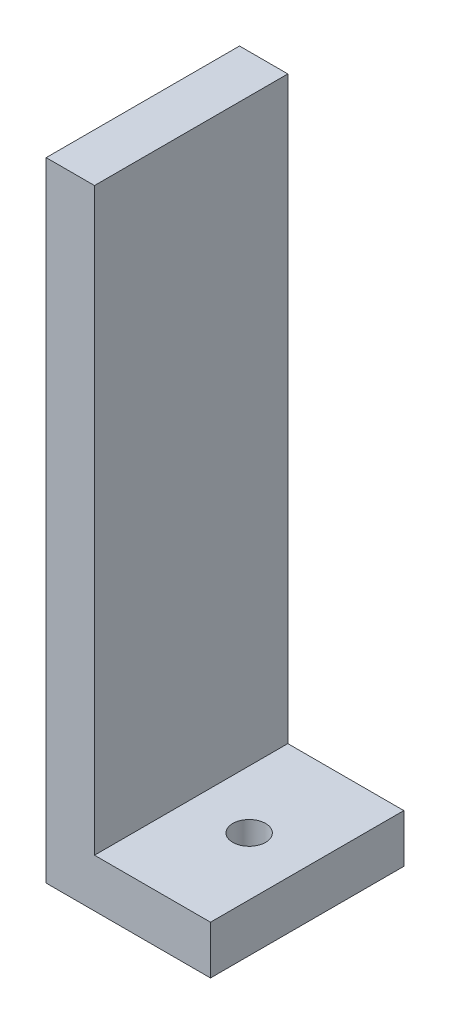
ISO-10303-21;
HEADER;
FILE_DESCRIPTION(('STEP AP214'),'2;1');
FILE_NAME('part.step','',(''),(''),'','','');
FILE_SCHEMA(('AUTOMOTIVE_DESIGN { 1 0 10303 214 1 1 1 1 }'));
ENDSEC;
DATA;
#1=APPLICATION_CONTEXT('core data for automotive mechanical design processes');
#2=APPLICATION_PROTOCOL_DEFINITION('international standard','automotive_design',2000,#1);
#3=PRODUCT_CONTEXT('',#1,'mechanical');
#4=PRODUCT('Part','Part','',(#3));
#5=PRODUCT_RELATED_PRODUCT_CATEGORY('part','',(#4));
#6=PRODUCT_DEFINITION_FORMATION('','',#4);
#7=PRODUCT_DEFINITION_CONTEXT('part definition',#1,'design');
#8=PRODUCT_DEFINITION('design','',#6,#7);
#9=PRODUCT_DEFINITION_SHAPE('','',#8);
#10=(LENGTH_UNIT() NAMED_UNIT(*) SI_UNIT(.MILLI.,.METRE.));
#11=(NAMED_UNIT(*) PLANE_ANGLE_UNIT() SI_UNIT($,.RADIAN.));
#12=(NAMED_UNIT(*) SI_UNIT($,.STERADIAN.) SOLID_ANGLE_UNIT());
#13=UNCERTAINTY_MEASURE_WITH_UNIT(LENGTH_MEASURE(1.E-05),#10,'distance_accuracy_value','');
#14=(GEOMETRIC_REPRESENTATION_CONTEXT(3) GLOBAL_UNCERTAINTY_ASSIGNED_CONTEXT((#13)) GLOBAL_UNIT_ASSIGNED_CONTEXT((#10,
#11,#12)) REPRESENTATION_CONTEXT('',''));
#15=CARTESIAN_POINT('',(0.,0.,0.));
#16=DIRECTION('',(0.,0.,1.));
#17=DIRECTION('',(1.,0.,0.));
#18=AXIS2_PLACEMENT_3D('',#15,#16,#17);
#19=CARTESIAN_POINT('',(0.,0.,20.));
#20=DIRECTION('',(-1.,0.,0.));
#21=DIRECTION('',(0.,0.,1.));
#22=AXIS2_PLACEMENT_3D('',#19,#20,#21);
#23=PLANE('',#22);
#24=DIRECTION('',(0.,1.,0.));
#25=VECTOR('',#24,1.);
#26=CARTESIAN_POINT('',(0.,0.,0.));
#27=LINE('',#26,#25);
#28=CARTESIAN_POINT('',(0.,0.,0.));
#29=VERTEX_POINT('',#28);
#30=CARTESIAN_POINT('',(0.,60.,0.));
#31=VERTEX_POINT('',#30);
#32=EDGE_CURVE('E117',#29,#31,#27,.T.);
#33=ORIENTED_EDGE('',*,*,#32,.T.);
#34=DIRECTION('',(0.,0.,-1.));
#35=VECTOR('',#34,1.);
#36=CARTESIAN_POINT('',(0.,60.,20.));
#37=LINE('',#36,#35);
#38=CARTESIAN_POINT('',(0.,60.,20.));
#39=VERTEX_POINT('',#38);
#40=EDGE_CURVE('E11',#39,#31,#37,.T.);
#41=ORIENTED_EDGE('',*,*,#40,.F.);
#42=DIRECTION('',(0.,1.,0.));
#43=VECTOR('',#42,1.);
#44=CARTESIAN_POINT('',(0.,0.,20.));
#45=LINE('',#44,#43);
#46=CARTESIAN_POINT('',(0.,0.,20.));
#47=VERTEX_POINT('',#46);
#48=EDGE_CURVE('E128',#47,#39,#45,.T.);
#49=ORIENTED_EDGE('',*,*,#48,.F.);
#50=DIRECTION('',(0.,0.,-1.));
#51=VECTOR('',#50,1.);
#52=CARTESIAN_POINT('',(0.,0.,20.));
#53=LINE('',#52,#51);
#54=EDGE_CURVE('E113',#47,#29,#53,.T.);
#55=ORIENTED_EDGE('',*,*,#54,.T.);
#56=EDGE_LOOP('',(#33,#41,#49,#55));
#57=FACE_BOUND('',#56,.T.);
#58=ADVANCED_FACE('F33',(#57),#23,.F.);
#59=CARTESIAN_POINT('',(0.,60.,20.));
#60=DIRECTION('',(0.,-1.,0.));
#61=DIRECTION('',(0.,0.,-1.));
#62=AXIS2_PLACEMENT_3D('',#59,#60,#61);
#63=PLANE('',#62);
#64=DIRECTION('',(-1.,0.,0.));
#65=VECTOR('',#64,1.);
#66=CARTESIAN_POINT('',(0.,60.,0.));
#67=LINE('',#66,#65);
#68=CARTESIAN_POINT('',(-5.,60.,0.));
#69=VERTEX_POINT('',#68);
#70=EDGE_CURVE('E120',#31,#69,#67,.T.);
#71=ORIENTED_EDGE('',*,*,#70,.T.);
#72=DIRECTION('',(0.,0.,-1.));
#73=VECTOR('',#72,1.);
#74=CARTESIAN_POINT('',(-5.,60.,20.));
#75=LINE('',#74,#73);
#76=CARTESIAN_POINT('',(-5.,60.,20.));
#77=VERTEX_POINT('',#76);
#78=EDGE_CURVE('E41',#77,#69,#75,.T.);
#79=ORIENTED_EDGE('',*,*,#78,.F.);
#80=DIRECTION('',(-1.,0.,0.));
#81=VECTOR('',#80,1.);
#82=CARTESIAN_POINT('',(0.,60.,20.));
#83=LINE('',#82,#81);
#84=EDGE_CURVE('E86',#39,#77,#83,.T.);
#85=ORIENTED_EDGE('',*,*,#84,.F.);
#86=ORIENTED_EDGE('',*,*,#40,.T.);
#87=EDGE_LOOP('',(#71,#79,#85,#86));
#88=FACE_BOUND('',#87,.T.);
#89=ADVANCED_FACE('F154',(#88),#63,.F.);
#90=CARTESIAN_POINT('',(-5.,60.,20.));
#91=DIRECTION('',(1.,0.,0.));
#92=DIRECTION('',(0.,1.,0.));
#93=AXIS2_PLACEMENT_3D('',#90,#91,#92);
#94=PLANE('',#93);
#95=DIRECTION('',(0.,-1.,0.));
#96=VECTOR('',#95,1.);
#97=CARTESIAN_POINT('',(-5.,60.,0.));
#98=LINE('',#97,#96);
#99=CARTESIAN_POINT('',(-5.,-5.,0.));
#100=VERTEX_POINT('',#99);
#101=EDGE_CURVE('E123',#69,#100,#98,.T.);
#102=ORIENTED_EDGE('',*,*,#101,.T.);
#103=DIRECTION('',(0.,0.,-1.));
#104=VECTOR('',#103,1.);
#105=CARTESIAN_POINT('',(-5.,-5.,20.));
#106=LINE('',#105,#104);
#107=CARTESIAN_POINT('',(-5.,-5.,20.));
#108=VERTEX_POINT('',#107);
#109=EDGE_CURVE('E108',#108,#100,#106,.T.);
#110=ORIENTED_EDGE('',*,*,#109,.F.);
#111=DIRECTION('',(0.,-1.,0.));
#112=VECTOR('',#111,1.);
#113=CARTESIAN_POINT('',(-5.,60.,20.));
#114=LINE('',#113,#112);
#115=EDGE_CURVE('E99',#77,#108,#114,.T.);
#116=ORIENTED_EDGE('',*,*,#115,.F.);
#117=ORIENTED_EDGE('',*,*,#78,.T.);
#118=EDGE_LOOP('',(#102,#110,#116,#117));
#119=FACE_BOUND('',#118,.T.);
#120=ADVANCED_FACE('F134',(#119),#94,.F.);
#121=CARTESIAN_POINT('',(-5.,-5.,20.));
#122=DIRECTION('',(0.,1.,0.));
#123=DIRECTION('',(0.,0.,1.));
#124=AXIS2_PLACEMENT_3D('',#121,#122,#123);
#125=PLANE('',#124);
#126=CARTESIAN_POINT('',(6.,-5.,10.));
#127=DIRECTION('',(0.,1.,0.));
#128=DIRECTION('',(0.,0.,1.));
#129=AXIS2_PLACEMENT_3D('',#126,#127,#128);
#130=CIRCLE('',#129,1.7);
#131=CARTESIAN_POINT('',(6.,-5.,11.7));
#132=VERTEX_POINT('',#131);
#133=EDGE_CURVE('E121',#132,#132,#130,.T.);
#134=ORIENTED_EDGE('',*,*,#133,.T.);
#135=EDGE_LOOP('',(#134));
#136=FACE_BOUND('',#135,.T.);
#137=DIRECTION('',(1.,0.,0.));
#138=VECTOR('',#137,1.);
#139=CARTESIAN_POINT('',(-5.,-5.,0.));
#140=LINE('',#139,#138);
#141=CARTESIAN_POINT('',(12.,-5.,0.));
#142=VERTEX_POINT('',#141);
#143=EDGE_CURVE('E107',#100,#142,#140,.T.);
#144=ORIENTED_EDGE('',*,*,#143,.T.);
#145=DIRECTION('',(0.,0.,-1.));
#146=VECTOR('',#145,1.);
#147=CARTESIAN_POINT('',(12.,-5.,20.));
#148=LINE('',#147,#146);
#149=CARTESIAN_POINT('',(12.,-5.,20.));
#150=VERTEX_POINT('',#149);
#151=EDGE_CURVE('E104',#150,#142,#148,.T.);
#152=ORIENTED_EDGE('',*,*,#151,.F.);
#153=DIRECTION('',(1.,0.,0.));
#154=VECTOR('',#153,1.);
#155=CARTESIAN_POINT('',(-5.,-5.,20.));
#156=LINE('',#155,#154);
#157=EDGE_CURVE('E93',#108,#150,#156,.T.);
#158=ORIENTED_EDGE('',*,*,#157,.F.);
#159=ORIENTED_EDGE('',*,*,#109,.T.);
#160=EDGE_LOOP('',(#144,#152,#158,#159));
#161=FACE_BOUND('',#160,.T.);
#162=ADVANCED_FACE('F105',(#136,#161),#125,.F.);
#163=CARTESIAN_POINT('',(12.,-5.,20.));
#164=DIRECTION('',(-1.,0.,0.));
#165=DIRECTION('',(0.,0.,1.));
#166=AXIS2_PLACEMENT_3D('',#163,#164,#165);
#167=PLANE('',#166);
#168=DIRECTION('',(0.,1.,0.));
#169=VECTOR('',#168,1.);
#170=CARTESIAN_POINT('',(12.,-5.,0.));
#171=LINE('',#170,#169);
#172=CARTESIAN_POINT('',(12.,0.,0.));
#173=VERTEX_POINT('',#172);
#174=EDGE_CURVE('E72',#142,#173,#171,.T.);
#175=ORIENTED_EDGE('',*,*,#174,.T.);
#176=DIRECTION('',(0.,0.,-1.));
#177=VECTOR('',#176,1.);
#178=CARTESIAN_POINT('',(12.,0.,20.));
#179=LINE('',#178,#177);
#180=CARTESIAN_POINT('',(12.,0.,20.));
#181=VERTEX_POINT('',#180);
#182=EDGE_CURVE('E109',#181,#173,#179,.T.);
#183=ORIENTED_EDGE('',*,*,#182,.F.);
#184=DIRECTION('',(0.,1.,0.));
#185=VECTOR('',#184,1.);
#186=CARTESIAN_POINT('',(12.,-5.,20.));
#187=LINE('',#186,#185);
#188=EDGE_CURVE('E97',#150,#181,#187,.T.);
#189=ORIENTED_EDGE('',*,*,#188,.F.);
#190=ORIENTED_EDGE('',*,*,#151,.T.);
#191=EDGE_LOOP('',(#175,#183,#189,#190));
#192=FACE_BOUND('',#191,.T.);
#193=ADVANCED_FACE('F111',(#192),#167,.F.);
#194=CARTESIAN_POINT('',(0.,0.,20.));
#195=DIRECTION('',(0.,-1.,0.));
#196=DIRECTION('',(0.,0.,-1.));
#197=AXIS2_PLACEMENT_3D('',#194,#195,#196);
#198=PLANE('',#197);
#199=CARTESIAN_POINT('',(6.,0.,10.));
#200=DIRECTION('',(0.,1.,0.));
#201=DIRECTION('',(0.,0.,1.));
#202=AXIS2_PLACEMENT_3D('',#199,#200,#201);
#203=CIRCLE('',#202,1.7);
#204=CARTESIAN_POINT('',(6.,0.,11.7));
#205=VERTEX_POINT('',#204);
#206=EDGE_CURVE('E170',#205,#205,#203,.T.);
#207=ORIENTED_EDGE('',*,*,#206,.F.);
#208=EDGE_LOOP('',(#207));
#209=FACE_BOUND('',#208,.T.);
#210=DIRECTION('',(-1.,0.,0.));
#211=VECTOR('',#210,1.);
#212=CARTESIAN_POINT('',(0.,0.,0.));
#213=LINE('',#212,#211);
#214=EDGE_CURVE('E78',#173,#29,#213,.T.);
#215=ORIENTED_EDGE('',*,*,#214,.T.);
#216=ORIENTED_EDGE('',*,*,#54,.F.);
#217=DIRECTION('',(-1.,0.,0.));
#218=VECTOR('',#217,1.);
#219=CARTESIAN_POINT('',(0.,0.,20.));
#220=LINE('',#219,#218);
#221=EDGE_CURVE('E49',#181,#47,#220,.T.);
#222=ORIENTED_EDGE('',*,*,#221,.F.);
#223=ORIENTED_EDGE('',*,*,#182,.T.);
#224=EDGE_LOOP('',(#215,#216,#222,#223));
#225=FACE_BOUND('',#224,.T.);
#226=ADVANCED_FACE('F141',(#209,#225),#198,.F.);
#227=CARTESIAN_POINT('',(0.,0.,20.));
#228=DIRECTION('',(0.,0.,1.));
#229=DIRECTION('',(1.,0.,0.));
#230=AXIS2_PLACEMENT_3D('',#227,#228,#229);
#231=PLANE('',#230);
#232=ORIENTED_EDGE('',*,*,#48,.T.);
#233=ORIENTED_EDGE('',*,*,#84,.T.);
#234=ORIENTED_EDGE('',*,*,#115,.T.);
#235=ORIENTED_EDGE('',*,*,#157,.T.);
#236=ORIENTED_EDGE('',*,*,#188,.T.);
#237=ORIENTED_EDGE('',*,*,#221,.T.);
#238=EDGE_LOOP('',(#232,#233,#234,#235,#236,#237));
#239=FACE_BOUND('',#238,.T.);
#240=ADVANCED_FACE('F95',(#239),#231,.T.);
#241=CARTESIAN_POINT('',(0.,0.,0.));
#242=DIRECTION('',(0.,0.,1.));
#243=DIRECTION('',(1.,0.,0.));
#244=AXIS2_PLACEMENT_3D('',#241,#242,#243);
#245=PLANE('',#244);
#246=ORIENTED_EDGE('',*,*,#32,.F.);
#247=ORIENTED_EDGE('',*,*,#214,.F.);
#248=ORIENTED_EDGE('',*,*,#174,.F.);
#249=ORIENTED_EDGE('',*,*,#143,.F.);
#250=ORIENTED_EDGE('',*,*,#101,.F.);
#251=ORIENTED_EDGE('',*,*,#70,.F.);
#252=EDGE_LOOP('',(#246,#247,#248,#249,#250,#251));
#253=FACE_BOUND('',#252,.T.);
#254=ADVANCED_FACE('F137',(#253),#245,.F.);
#255=CARTESIAN_POINT('',(6.,-20.,10.));
#256=DIRECTION('',(0.,1.,0.));
#257=DIRECTION('',(0.,0.,1.));
#258=AXIS2_PLACEMENT_3D('',#255,#256,#257);
#259=CYLINDRICAL_SURFACE('',#258,1.7);
#260=ORIENTED_EDGE('',*,*,#206,.T.);
#261=EDGE_LOOP('',(#260));
#262=FACE_BOUND('',#261,.T.);
#263=ORIENTED_EDGE('',*,*,#133,.F.);
#264=EDGE_LOOP('',(#263));
#265=FACE_BOUND('',#264,.T.);
#266=ADVANCED_FACE('F177',(#262,#265),#259,.F.);
#267=CLOSED_SHELL('',(#58,#89,#120,#162,#193,#226,#240,#254,#266));
#268=MANIFOLD_SOLID_BREP('B2',#267);
#269=ADVANCED_BREP_SHAPE_REPRESENTATION('',(#18,#268),#14);
#270=SHAPE_DEFINITION_REPRESENTATION(#9,#269);
ENDSEC;
END-ISO-10303-21;
